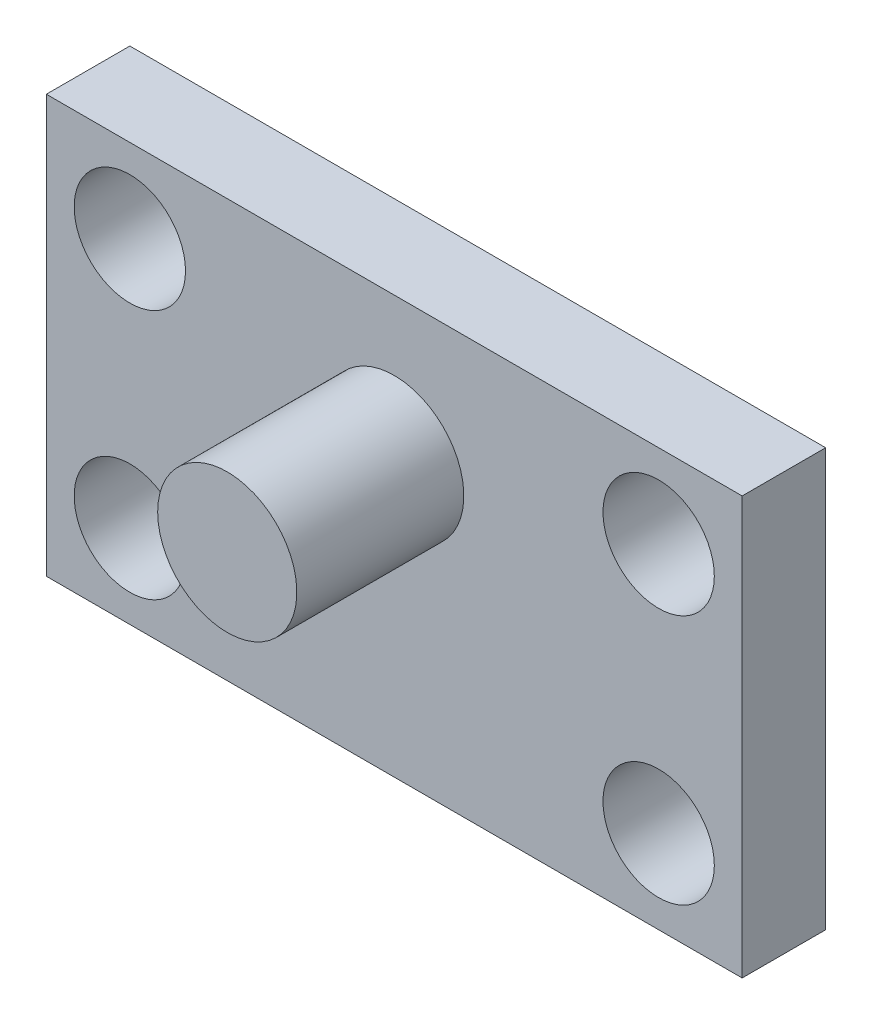
ISO-10303-21;
HEADER;
FILE_DESCRIPTION(('STEP AP214'),'2;1');
FILE_NAME('part.step','',(''),(''),'','','');
FILE_SCHEMA(('AUTOMOTIVE_DESIGN { 1 0 10303 214 1 1 1 1 }'));
ENDSEC;
DATA;
#1=APPLICATION_CONTEXT('core data for automotive mechanical design processes');
#2=APPLICATION_PROTOCOL_DEFINITION('international standard','automotive_design',2000,#1);
#3=PRODUCT_CONTEXT('',#1,'mechanical');
#4=PRODUCT('Part','Part','',(#3));
#5=PRODUCT_RELATED_PRODUCT_CATEGORY('part','',(#4));
#6=PRODUCT_DEFINITION_FORMATION('','',#4);
#7=PRODUCT_DEFINITION_CONTEXT('part definition',#1,'design');
#8=PRODUCT_DEFINITION('design','',#6,#7);
#9=PRODUCT_DEFINITION_SHAPE('','',#8);
#10=(LENGTH_UNIT() NAMED_UNIT(*) SI_UNIT(.MILLI.,.METRE.));
#11=(NAMED_UNIT(*) PLANE_ANGLE_UNIT() SI_UNIT($,.RADIAN.));
#12=(NAMED_UNIT(*) SI_UNIT($,.STERADIAN.) SOLID_ANGLE_UNIT());
#13=UNCERTAINTY_MEASURE_WITH_UNIT(LENGTH_MEASURE(1.E-05),#10,'distance_accuracy_value','');
#14=(GEOMETRIC_REPRESENTATION_CONTEXT(3) GLOBAL_UNCERTAINTY_ASSIGNED_CONTEXT((#13)) GLOBAL_UNIT_ASSIGNED_CONTEXT((#10,
#11,#12)) REPRESENTATION_CONTEXT('',''));
#15=CARTESIAN_POINT('',(0.,0.,0.));
#16=DIRECTION('',(0.,0.,1.));
#17=DIRECTION('',(1.,0.,0.));
#18=AXIS2_PLACEMENT_3D('',#15,#16,#17);
#19=CARTESIAN_POINT('',(0.,0.,30.));
#20=DIRECTION('',(0.,0.,-1.));
#21=DIRECTION('',(-1.,0.,0.));
#22=AXIS2_PLACEMENT_3D('',#19,#20,#21);
#23=PLANE('',#22);
#24=CARTESIAN_POINT('',(125.,100.,30.));
#25=DIRECTION('',(0.,0.,-1.));
#26=DIRECTION('',(-1.,0.,0.));
#27=AXIS2_PLACEMENT_3D('',#24,#25,#26);
#28=CIRCLE('',#27,25.);
#29=CARTESIAN_POINT('',(100.,100.,30.));
#30=VERTEX_POINT('',#29);
#31=EDGE_CURVE('E11',#30,#30,#28,.F.);
#32=ORIENTED_EDGE('',*,*,#31,.F.);
#33=EDGE_LOOP('',(#32));
#34=FACE_BOUND('',#33,.T.);
#35=DIRECTION('',(0.,-1.,0.));
#36=VECTOR('',#35,1.);
#37=CARTESIAN_POINT('',(0.,0.,30.));
#38=LINE('',#37,#36);
#39=CARTESIAN_POINT('',(0.,150.,30.));
#40=VERTEX_POINT('',#39);
#41=CARTESIAN_POINT('',(0.,0.,30.));
#42=VERTEX_POINT('',#41);
#43=EDGE_CURVE('E91',#40,#42,#38,.T.);
#44=ORIENTED_EDGE('',*,*,#43,.T.);
#45=DIRECTION('',(1.,0.,0.));
#46=VECTOR('',#45,1.);
#47=CARTESIAN_POINT('',(0.,0.,30.));
#48=LINE('',#47,#46);
#49=CARTESIAN_POINT('',(250.,0.,30.));
#50=VERTEX_POINT('',#49);
#51=EDGE_CURVE('E86',#42,#50,#48,.T.);
#52=ORIENTED_EDGE('',*,*,#51,.T.);
#53=DIRECTION('',(0.,1.,0.));
#54=VECTOR('',#53,1.);
#55=CARTESIAN_POINT('',(250.,0.,30.));
#56=LINE('',#55,#54);
#57=CARTESIAN_POINT('',(250.,150.,30.));
#58=VERTEX_POINT('',#57);
#59=EDGE_CURVE('E89',#50,#58,#56,.T.);
#60=ORIENTED_EDGE('',*,*,#59,.T.);
#61=DIRECTION('',(-1.,0.,0.));
#62=VECTOR('',#61,1.);
#63=CARTESIAN_POINT('',(0.,150.,30.));
#64=LINE('',#63,#62);
#65=EDGE_CURVE('E55',#58,#40,#64,.T.);
#66=ORIENTED_EDGE('',*,*,#65,.T.);
#67=EDGE_LOOP('',(#44,#52,#60,#66));
#68=FACE_BOUND('',#67,.T.);
#69=CARTESIAN_POINT('',(30.,30.,30.));
#70=DIRECTION('',(0.,0.,1.));
#71=DIRECTION('',(1.,0.,0.));
#72=AXIS2_PLACEMENT_3D('',#69,#70,#71);
#73=CIRCLE('',#72,20.);
#74=CARTESIAN_POINT('',(50.,30.,30.));
#75=VERTEX_POINT('',#74);
#76=EDGE_CURVE('E107',#75,#75,#73,.T.);
#77=ORIENTED_EDGE('',*,*,#76,.F.);
#78=EDGE_LOOP('',(#77));
#79=FACE_BOUND('',#78,.T.);
#80=CARTESIAN_POINT('',(220.,30.,30.));
#81=DIRECTION('',(0.,0.,1.));
#82=DIRECTION('',(1.,0.,0.));
#83=AXIS2_PLACEMENT_3D('',#80,#81,#82);
#84=CIRCLE('',#83,20.);
#85=CARTESIAN_POINT('',(240.,30.,30.));
#86=VERTEX_POINT('',#85);
#87=EDGE_CURVE('E122',#86,#86,#84,.T.);
#88=ORIENTED_EDGE('',*,*,#87,.F.);
#89=EDGE_LOOP('',(#88));
#90=FACE_BOUND('',#89,.T.);
#91=CARTESIAN_POINT('',(220.,120.,30.));
#92=DIRECTION('',(0.,0.,1.));
#93=DIRECTION('',(1.,0.,0.));
#94=AXIS2_PLACEMENT_3D('',#91,#92,#93);
#95=CIRCLE('',#94,20.);
#96=CARTESIAN_POINT('',(240.,120.,30.));
#97=VERTEX_POINT('',#96);
#98=EDGE_CURVE('E128',#97,#97,#95,.T.);
#99=ORIENTED_EDGE('',*,*,#98,.F.);
#100=EDGE_LOOP('',(#99));
#101=FACE_BOUND('',#100,.T.);
#102=CARTESIAN_POINT('',(29.9999999999997,120.,30.));
#103=DIRECTION('',(0.,0.,1.));
#104=DIRECTION('',(1.,0.,0.));
#105=AXIS2_PLACEMENT_3D('',#102,#103,#104);
#106=CIRCLE('',#105,20.);
#107=CARTESIAN_POINT('',(49.9999999999997,120.,30.));
#108=VERTEX_POINT('',#107);
#109=EDGE_CURVE('E134',#108,#108,#106,.T.);
#110=ORIENTED_EDGE('',*,*,#109,.F.);
#111=EDGE_LOOP('',(#110));
#112=FACE_BOUND('',#111,.T.);
#113=ADVANCED_FACE('F37',(#34,#68,#79,#90,#101,#112),#23,.F.);
#114=CARTESIAN_POINT('',(0.,0.,0.));
#115=DIRECTION('',(0.,0.,-1.));
#116=DIRECTION('',(-1.,0.,0.));
#117=AXIS2_PLACEMENT_3D('',#114,#115,#116);
#118=PLANE('',#117);
#119=CARTESIAN_POINT('',(220.,120.,0.));
#120=DIRECTION('',(0.,0.,1.));
#121=DIRECTION('',(1.,0.,0.));
#122=AXIS2_PLACEMENT_3D('',#119,#120,#121);
#123=CIRCLE('',#122,20.);
#124=CARTESIAN_POINT('',(240.,120.,0.));
#125=VERTEX_POINT('',#124);
#126=EDGE_CURVE('E131',#125,#125,#123,.T.);
#127=ORIENTED_EDGE('',*,*,#126,.T.);
#128=EDGE_LOOP('',(#127));
#129=FACE_BOUND('',#128,.T.);
#130=CARTESIAN_POINT('',(30.,30.,0.));
#131=DIRECTION('',(0.,0.,1.));
#132=DIRECTION('',(1.,0.,0.));
#133=AXIS2_PLACEMENT_3D('',#130,#131,#132);
#134=CIRCLE('',#133,20.);
#135=CARTESIAN_POINT('',(50.,30.,0.));
#136=VERTEX_POINT('',#135);
#137=EDGE_CURVE('E119',#136,#136,#134,.T.);
#138=ORIENTED_EDGE('',*,*,#137,.T.);
#139=EDGE_LOOP('',(#138));
#140=FACE_BOUND('',#139,.T.);
#141=DIRECTION('',(0.,-1.,0.));
#142=VECTOR('',#141,1.);
#143=CARTESIAN_POINT('',(0.,0.,0.));
#144=LINE('',#143,#142);
#145=CARTESIAN_POINT('',(0.,150.,0.));
#146=VERTEX_POINT('',#145);
#147=CARTESIAN_POINT('',(0.,0.,0.));
#148=VERTEX_POINT('',#147);
#149=EDGE_CURVE('E104',#146,#148,#144,.T.);
#150=ORIENTED_EDGE('',*,*,#149,.F.);
#151=DIRECTION('',(-1.,0.,0.));
#152=VECTOR('',#151,1.);
#153=CARTESIAN_POINT('',(0.,150.,0.));
#154=LINE('',#153,#152);
#155=CARTESIAN_POINT('',(250.,150.,0.));
#156=VERTEX_POINT('',#155);
#157=EDGE_CURVE('E78',#156,#146,#154,.T.);
#158=ORIENTED_EDGE('',*,*,#157,.F.);
#159=DIRECTION('',(0.,1.,0.));
#160=VECTOR('',#159,1.);
#161=CARTESIAN_POINT('',(250.,0.,0.));
#162=LINE('',#161,#160);
#163=CARTESIAN_POINT('',(250.,0.,0.));
#164=VERTEX_POINT('',#163);
#165=EDGE_CURVE('E72',#164,#156,#162,.T.);
#166=ORIENTED_EDGE('',*,*,#165,.F.);
#167=DIRECTION('',(1.,0.,0.));
#168=VECTOR('',#167,1.);
#169=CARTESIAN_POINT('',(0.,0.,0.));
#170=LINE('',#169,#168);
#171=EDGE_CURVE('E96',#148,#164,#170,.T.);
#172=ORIENTED_EDGE('',*,*,#171,.F.);
#173=EDGE_LOOP('',(#150,#158,#166,#172));
#174=FACE_BOUND('',#173,.T.);
#175=CARTESIAN_POINT('',(220.,30.,0.));
#176=DIRECTION('',(0.,0.,1.));
#177=DIRECTION('',(1.,0.,0.));
#178=AXIS2_PLACEMENT_3D('',#175,#176,#177);
#179=CIRCLE('',#178,20.);
#180=CARTESIAN_POINT('',(240.,30.,0.));
#181=VERTEX_POINT('',#180);
#182=EDGE_CURVE('E125',#181,#181,#179,.T.);
#183=ORIENTED_EDGE('',*,*,#182,.T.);
#184=EDGE_LOOP('',(#183));
#185=FACE_BOUND('',#184,.T.);
#186=CARTESIAN_POINT('',(29.9999999999997,120.,0.));
#187=DIRECTION('',(0.,0.,1.));
#188=DIRECTION('',(1.,0.,0.));
#189=AXIS2_PLACEMENT_3D('',#186,#187,#188);
#190=CIRCLE('',#189,20.);
#191=CARTESIAN_POINT('',(49.9999999999997,120.,0.));
#192=VERTEX_POINT('',#191);
#193=EDGE_CURVE('E137',#192,#192,#190,.T.);
#194=ORIENTED_EDGE('',*,*,#193,.T.);
#195=EDGE_LOOP('',(#194));
#196=FACE_BOUND('',#195,.T.);
#197=ADVANCED_FACE('F115',(#129,#140,#174,#185,#196),#118,.T.);
#198=CARTESIAN_POINT('',(0.,0.,30.));
#199=DIRECTION('',(1.,0.,0.));
#200=DIRECTION('',(0.,1.,0.));
#201=AXIS2_PLACEMENT_3D('',#198,#199,#200);
#202=PLANE('',#201);
#203=ORIENTED_EDGE('',*,*,#149,.T.);
#204=DIRECTION('',(0.,0.,-1.));
#205=VECTOR('',#204,1.);
#206=CARTESIAN_POINT('',(0.,0.,30.));
#207=LINE('',#206,#205);
#208=EDGE_CURVE('E41',#42,#148,#207,.T.);
#209=ORIENTED_EDGE('',*,*,#208,.F.);
#210=ORIENTED_EDGE('',*,*,#43,.F.);
#211=DIRECTION('',(0.,0.,-1.));
#212=VECTOR('',#211,1.);
#213=CARTESIAN_POINT('',(0.,150.,30.));
#214=LINE('',#213,#212);
#215=EDGE_CURVE('E100',#40,#146,#214,.T.);
#216=ORIENTED_EDGE('',*,*,#215,.T.);
#217=EDGE_LOOP('',(#203,#209,#210,#216));
#218=FACE_BOUND('',#217,.T.);
#219=ADVANCED_FACE('F39',(#218),#202,.F.);
#220=CARTESIAN_POINT('',(0.,0.,30.));
#221=DIRECTION('',(0.,1.,0.));
#222=DIRECTION('',(0.,0.,1.));
#223=AXIS2_PLACEMENT_3D('',#220,#221,#222);
#224=PLANE('',#223);
#225=ORIENTED_EDGE('',*,*,#171,.T.);
#226=DIRECTION('',(0.,0.,-1.));
#227=VECTOR('',#226,1.);
#228=CARTESIAN_POINT('',(250.,0.,30.));
#229=LINE('',#228,#227);
#230=EDGE_CURVE('E94',#50,#164,#229,.T.);
#231=ORIENTED_EDGE('',*,*,#230,.F.);
#232=ORIENTED_EDGE('',*,*,#51,.F.);
#233=ORIENTED_EDGE('',*,*,#208,.T.);
#234=EDGE_LOOP('',(#225,#231,#232,#233));
#235=FACE_BOUND('',#234,.T.);
#236=ADVANCED_FACE('F95',(#235),#224,.F.);
#237=CARTESIAN_POINT('',(250.,0.,30.));
#238=DIRECTION('',(-1.,0.,0.));
#239=DIRECTION('',(0.,0.,1.));
#240=AXIS2_PLACEMENT_3D('',#237,#238,#239);
#241=PLANE('',#240);
#242=ORIENTED_EDGE('',*,*,#165,.T.);
#243=DIRECTION('',(0.,0.,-1.));
#244=VECTOR('',#243,1.);
#245=CARTESIAN_POINT('',(250.,150.,30.));
#246=LINE('',#245,#244);
#247=EDGE_CURVE('E97',#58,#156,#246,.T.);
#248=ORIENTED_EDGE('',*,*,#247,.F.);
#249=ORIENTED_EDGE('',*,*,#59,.F.);
#250=ORIENTED_EDGE('',*,*,#230,.T.);
#251=EDGE_LOOP('',(#242,#248,#249,#250));
#252=FACE_BOUND('',#251,.T.);
#253=ADVANCED_FACE('F98',(#252),#241,.F.);
#254=CARTESIAN_POINT('',(0.,150.,30.));
#255=DIRECTION('',(0.,-1.,0.));
#256=DIRECTION('',(0.,0.,-1.));
#257=AXIS2_PLACEMENT_3D('',#254,#255,#256);
#258=PLANE('',#257);
#259=ORIENTED_EDGE('',*,*,#157,.T.);
#260=ORIENTED_EDGE('',*,*,#215,.F.);
#261=ORIENTED_EDGE('',*,*,#65,.F.);
#262=ORIENTED_EDGE('',*,*,#247,.T.);
#263=EDGE_LOOP('',(#259,#260,#261,#262));
#264=FACE_BOUND('',#263,.T.);
#265=ADVANCED_FACE('F112',(#264),#258,.F.);
#266=CARTESIAN_POINT('',(30.,30.,30.));
#267=DIRECTION('',(0.,0.,-1.));
#268=DIRECTION('',(-1.,0.,0.));
#269=AXIS2_PLACEMENT_3D('',#266,#267,#268);
#270=CYLINDRICAL_SURFACE('',#269,20.);
#271=ORIENTED_EDGE('',*,*,#76,.T.);
#272=EDGE_LOOP('',(#271));
#273=FACE_BOUND('',#272,.T.);
#274=ORIENTED_EDGE('',*,*,#137,.F.);
#275=EDGE_LOOP('',(#274));
#276=FACE_BOUND('',#275,.T.);
#277=ADVANCED_FACE('F163',(#273,#276),#270,.F.);
#278=CARTESIAN_POINT('',(220.,30.,30.));
#279=DIRECTION('',(0.,0.,-1.));
#280=DIRECTION('',(-1.,0.,0.));
#281=AXIS2_PLACEMENT_3D('',#278,#279,#280);
#282=CYLINDRICAL_SURFACE('',#281,20.);
#283=ORIENTED_EDGE('',*,*,#87,.T.);
#284=EDGE_LOOP('',(#283));
#285=FACE_BOUND('',#284,.T.);
#286=ORIENTED_EDGE('',*,*,#182,.F.);
#287=EDGE_LOOP('',(#286));
#288=FACE_BOUND('',#287,.T.);
#289=ADVANCED_FACE('F219',(#285,#288),#282,.F.);
#290=CARTESIAN_POINT('',(220.,120.,30.));
#291=DIRECTION('',(0.,0.,-1.));
#292=DIRECTION('',(-1.,0.,0.));
#293=AXIS2_PLACEMENT_3D('',#290,#291,#292);
#294=CYLINDRICAL_SURFACE('',#293,20.);
#295=ORIENTED_EDGE('',*,*,#98,.T.);
#296=EDGE_LOOP('',(#295));
#297=FACE_BOUND('',#296,.T.);
#298=ORIENTED_EDGE('',*,*,#126,.F.);
#299=EDGE_LOOP('',(#298));
#300=FACE_BOUND('',#299,.T.);
#301=ADVANCED_FACE('F210',(#297,#300),#294,.F.);
#302=CARTESIAN_POINT('',(29.9999999999997,120.,30.));
#303=DIRECTION('',(0.,0.,-1.));
#304=DIRECTION('',(-1.,0.,0.));
#305=AXIS2_PLACEMENT_3D('',#302,#303,#304);
#306=CYLINDRICAL_SURFACE('',#305,20.);
#307=ORIENTED_EDGE('',*,*,#109,.T.);
#308=EDGE_LOOP('',(#307));
#309=FACE_BOUND('',#308,.T.);
#310=ORIENTED_EDGE('',*,*,#193,.F.);
#311=EDGE_LOOP('',(#310));
#312=FACE_BOUND('',#311,.T.);
#313=ADVANCED_FACE('F151',(#309,#312),#306,.F.);
#314=CARTESIAN_POINT('',(125.,100.,90.));
#315=DIRECTION('',(0.,0.,-1.));
#316=DIRECTION('',(-1.,0.,0.));
#317=AXIS2_PLACEMENT_3D('',#314,#315,#316);
#318=CYLINDRICAL_SURFACE('',#317,25.);
#319=CARTESIAN_POINT('',(125.,100.,90.));
#320=DIRECTION('',(0.,0.,1.));
#321=DIRECTION('',(1.,0.,0.));
#322=AXIS2_PLACEMENT_3D('',#319,#320,#321);
#323=CIRCLE('',#322,25.);
#324=CARTESIAN_POINT('',(100.,100.,90.));
#325=VERTEX_POINT('',#324);
#326=EDGE_CURVE('E140',#325,#325,#323,.T.);
#327=CARTESIAN_POINT('',(100.,100.,90.));
#328=CARTESIAN_POINT('',(100.,100.,89.375));
#329=CARTESIAN_POINT('',(100.,100.,88.75));
#330=CARTESIAN_POINT('',(100.,100.,87.5));
#331=CARTESIAN_POINT('',(100.,100.,86.875));
#332=CARTESIAN_POINT('',(100.,100.,85.625));
#333=CARTESIAN_POINT('',(100.,100.,85.));
#334=CARTESIAN_POINT('',(100.,100.,83.75));
#335=CARTESIAN_POINT('',(100.,100.,83.125));
#336=CARTESIAN_POINT('',(100.,100.,81.875));
#337=CARTESIAN_POINT('',(100.,100.,81.25));
#338=CARTESIAN_POINT('',(100.,100.,80.));
#339=CARTESIAN_POINT('',(100.,100.,79.375));
#340=CARTESIAN_POINT('',(100.,100.,78.125));
#341=CARTESIAN_POINT('',(100.,100.,77.5));
#342=CARTESIAN_POINT('',(100.,100.,76.25));
#343=CARTESIAN_POINT('',(100.,100.,75.625));
#344=CARTESIAN_POINT('',(100.,100.,74.375));
#345=CARTESIAN_POINT('',(100.,100.,73.75));
#346=CARTESIAN_POINT('',(100.,100.,72.5));
#347=CARTESIAN_POINT('',(100.,100.,71.875));
#348=CARTESIAN_POINT('',(100.,100.,70.625));
#349=CARTESIAN_POINT('',(100.,100.,70.));
#350=CARTESIAN_POINT('',(100.,100.,68.75));
#351=CARTESIAN_POINT('',(100.,100.,68.125));
#352=CARTESIAN_POINT('',(100.,100.,66.875));
#353=CARTESIAN_POINT('',(100.,100.,66.25));
#354=CARTESIAN_POINT('',(100.,100.,65.));
#355=CARTESIAN_POINT('',(100.,100.,64.375));
#356=CARTESIAN_POINT('',(100.,100.,63.125));
#357=CARTESIAN_POINT('',(100.,100.,62.5));
#358=CARTESIAN_POINT('',(100.,100.,61.25));
#359=CARTESIAN_POINT('',(100.,100.,60.625));
#360=CARTESIAN_POINT('',(100.,100.,59.375));
#361=CARTESIAN_POINT('',(100.,100.,58.75));
#362=CARTESIAN_POINT('',(100.,100.,57.5));
#363=CARTESIAN_POINT('',(100.,100.,56.875));
#364=CARTESIAN_POINT('',(100.,100.,55.625));
#365=CARTESIAN_POINT('',(100.,100.,55.));
#366=CARTESIAN_POINT('',(100.,100.,53.75));
#367=CARTESIAN_POINT('',(100.,100.,53.125));
#368=CARTESIAN_POINT('',(100.,100.,51.875));
#369=CARTESIAN_POINT('',(100.,100.,51.25));
#370=CARTESIAN_POINT('',(100.,100.,50.));
#371=CARTESIAN_POINT('',(100.,100.,49.375));
#372=CARTESIAN_POINT('',(100.,100.,48.125));
#373=CARTESIAN_POINT('',(100.,100.,47.5));
#374=CARTESIAN_POINT('',(100.,100.,46.25));
#375=CARTESIAN_POINT('',(100.,100.,45.625));
#376=CARTESIAN_POINT('',(100.,100.,44.375));
#377=CARTESIAN_POINT('',(100.,100.,43.75));
#378=CARTESIAN_POINT('',(100.,100.,42.5));
#379=CARTESIAN_POINT('',(100.,100.,41.875));
#380=CARTESIAN_POINT('',(100.,100.,40.625));
#381=CARTESIAN_POINT('',(100.,100.,40.));
#382=CARTESIAN_POINT('',(100.,100.,38.75));
#383=CARTESIAN_POINT('',(100.,100.,38.125));
#384=CARTESIAN_POINT('',(100.,100.,36.875));
#385=CARTESIAN_POINT('',(100.,100.,36.25));
#386=CARTESIAN_POINT('',(100.,100.,35.));
#387=CARTESIAN_POINT('',(100.,100.,34.375));
#388=CARTESIAN_POINT('',(100.,100.,33.125));
#389=CARTESIAN_POINT('',(100.,100.,32.5));
#390=CARTESIAN_POINT('',(100.,100.,31.25));
#391=CARTESIAN_POINT('',(100.,100.,30.625));
#392=CARTESIAN_POINT('',(100.,100.,30.));
#393=B_SPLINE_CURVE_WITH_KNOTS('',3,(#327,#328,#329,#330,#331,#332,#333,#334,#335,#336,#337,
#338,#339,#340,#341,#342,#343,#344,#345,#346,#347,#348,#349,#350,#351,#352,#353,#354,#355,#356,
#357,#358,#359,#360,#361,#362,#363,#364,#365,#366,#367,#368,#369,#370,#371,#372,#373,#374,#375,
#376,#377,#378,#379,#380,#381,#382,#383,#384,#385,#386,#387,#388,#389,#390,#391,#392),
.UNSPECIFIED.,.F.,.F.,(4,2,2,2,2,2,2,2,2,2,2,2,2,2,2,2,2,2,2,2,2,2,2,2,2,2,2,2,2,2,2,2,4),(0.,
1.875,3.75,5.62500000000001,7.50000000000001,9.37500000000001,11.25,13.125,15.,16.875,18.75,
20.625,22.5,24.375,26.25,28.125,30.,31.875,33.75,35.625,37.5,39.375,41.25,43.125,45.,46.875,
48.75,50.625,52.5,54.375,56.25,58.125,60.),.UNSPECIFIED.);
#394=EDGE_CURVE('BSEAM148',#325,#30,#393,.T.);
#395=ORIENTED_EDGE('',*,*,#326,.F.);
#396=ORIENTED_EDGE('',*,*,#31,.T.);
#397=ORIENTED_EDGE('',*,*,#394,.T.);
#398=ORIENTED_EDGE('',*,*,#394,.F.);
#399=EDGE_LOOP('',(#395,#397,#396,#398));
#400=FACE_BOUND('',#399,.T.);
#401=ADVANCED_FACE('F148',(#400),#318,.T.);
#402=CARTESIAN_POINT('',(125.,100.,90.));
#403=DIRECTION('',(0.,0.,1.));
#404=DIRECTION('',(1.,0.,0.));
#405=AXIS2_PLACEMENT_3D('',#402,#403,#404);
#406=PLANE('',#405);
#407=ORIENTED_EDGE('',*,*,#326,.T.);
#408=EDGE_LOOP('',(#407));
#409=FACE_BOUND('',#408,.T.);
#410=ADVANCED_FACE('F146',(#409),#406,.T.);
#411=CLOSED_SHELL('',(#113,#197,#219,#236,#253,#265,#277,#289,#301,#313,#401,#410));
#412=MANIFOLD_SOLID_BREP('B2',#411);
#413=ADVANCED_BREP_SHAPE_REPRESENTATION('',(#18,#412),#14);
#414=SHAPE_DEFINITION_REPRESENTATION(#9,#413);
ENDSEC;
END-ISO-10303-21;
